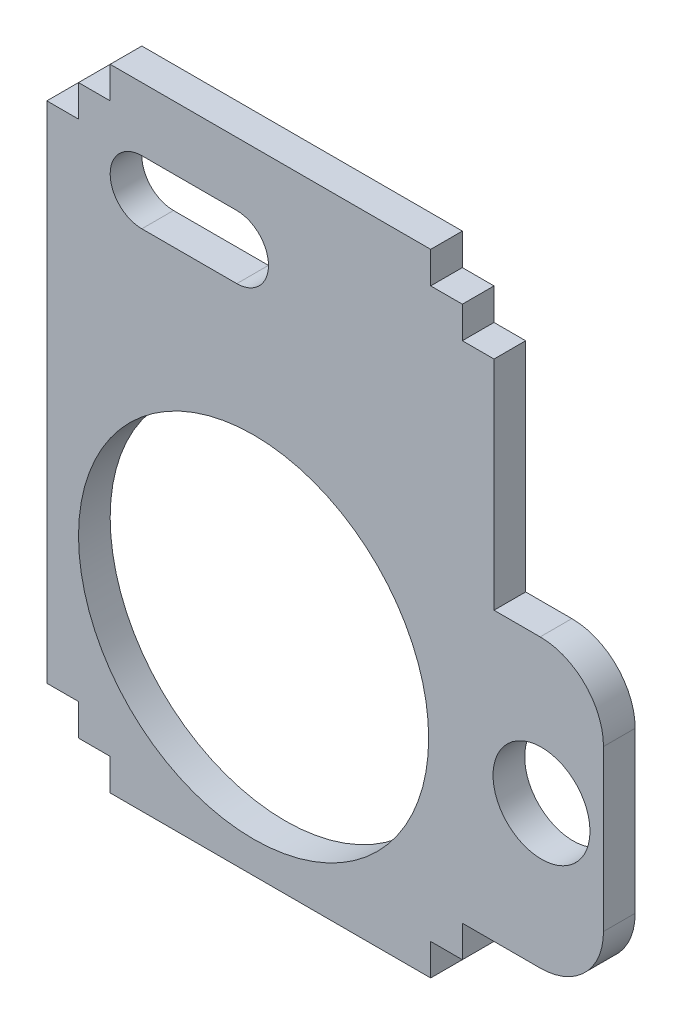
ISO-10303-21;
HEADER;
FILE_DESCRIPTION(('STEP AP214'),'2;1');
FILE_NAME('part.step','',(''),(''),'','','');
FILE_SCHEMA(('AUTOMOTIVE_DESIGN { 1 0 10303 214 1 1 1 1 }'));
ENDSEC;
DATA;
#1=APPLICATION_CONTEXT('core data for automotive mechanical design processes');
#2=APPLICATION_PROTOCOL_DEFINITION('international standard','automotive_design',2000,#1);
#3=PRODUCT_CONTEXT('',#1,'mechanical');
#4=PRODUCT('Part','Part','',(#3));
#5=PRODUCT_RELATED_PRODUCT_CATEGORY('part','',(#4));
#6=PRODUCT_DEFINITION_FORMATION('','',#4);
#7=PRODUCT_DEFINITION_CONTEXT('part definition',#1,'design');
#8=PRODUCT_DEFINITION('design','',#6,#7);
#9=PRODUCT_DEFINITION_SHAPE('','',#8);
#10=(LENGTH_UNIT() NAMED_UNIT(*) SI_UNIT(.MILLI.,.METRE.));
#11=(NAMED_UNIT(*) PLANE_ANGLE_UNIT() SI_UNIT($,.RADIAN.));
#12=(NAMED_UNIT(*) SI_UNIT($,.STERADIAN.) SOLID_ANGLE_UNIT());
#13=UNCERTAINTY_MEASURE_WITH_UNIT(LENGTH_MEASURE(1.E-05),#10,'distance_accuracy_value','');
#14=(GEOMETRIC_REPRESENTATION_CONTEXT(3) GLOBAL_UNCERTAINTY_ASSIGNED_CONTEXT((#13)) GLOBAL_UNIT_ASSIGNED_CONTEXT((#10,
#11,#12)) REPRESENTATION_CONTEXT('',''));
#15=CARTESIAN_POINT('',(0.,0.,0.));
#16=DIRECTION('',(0.,0.,1.));
#17=DIRECTION('',(1.,0.,0.));
#18=AXIS2_PLACEMENT_3D('',#15,#16,#17);
#19=CARTESIAN_POINT('',(-30.2332861119316,-35.1836502917995,-6.35));
#20=DIRECTION('',(0.,-1.,0.));
#21=DIRECTION('',(0.,0.,-1.));
#22=AXIS2_PLACEMENT_3D('',#19,#20,#21);
#23=PLANE('',#22);
#24=DIRECTION('',(1.,0.,0.));
#25=VECTOR('',#24,1.);
#26=CARTESIAN_POINT('',(-30.2332861119316,-35.1836502917995,0.));
#27=LINE('',#26,#25);
#28=CARTESIAN_POINT('',(-30.2332861119316,-35.1836502917995,0.));
#29=VERTEX_POINT('',#28);
#30=CARTESIAN_POINT('',(-23.8832861119316,-35.1836502917995,0.));
#31=VERTEX_POINT('',#30);
#32=EDGE_CURVE('E264',#29,#31,#27,.T.);
#33=ORIENTED_EDGE('',*,*,#32,.F.);
#34=DIRECTION('',(0.,0.,1.));
#35=VECTOR('',#34,1.);
#36=CARTESIAN_POINT('',(-30.2332861119316,-35.1836502917995,-6.35));
#37=LINE('',#36,#35);
#38=CARTESIAN_POINT('',(-30.2332861119316,-35.1836502917995,-6.35));
#39=VERTEX_POINT('',#38);
#40=EDGE_CURVE('E11',#39,#29,#37,.T.);
#41=ORIENTED_EDGE('',*,*,#40,.F.);
#42=DIRECTION('',(1.,0.,0.));
#43=VECTOR('',#42,1.);
#44=CARTESIAN_POINT('',(-30.2332861119316,-35.1836502917995,-6.35));
#45=LINE('',#44,#43);
#46=CARTESIAN_POINT('',(-23.8832861119316,-35.1836502917995,-6.35));
#47=VERTEX_POINT('',#46);
#48=EDGE_CURVE('E267',#39,#47,#45,.T.);
#49=ORIENTED_EDGE('',*,*,#48,.T.);
#50=DIRECTION('',(0.,0.,1.));
#51=VECTOR('',#50,1.);
#52=CARTESIAN_POINT('',(-23.8832861119316,-35.1836502917995,-6.35));
#53=LINE('',#52,#51);
#54=EDGE_CURVE('E36',#47,#31,#53,.T.);
#55=ORIENTED_EDGE('',*,*,#54,.T.);
#56=EDGE_LOOP('',(#33,#41,#49,#55));
#57=FACE_BOUND('',#56,.T.);
#58=ADVANCED_FACE('F33',(#57),#23,.T.);
#59=CARTESIAN_POINT('',(-30.2332861119316,-28.8336502917995,-6.35));
#60=DIRECTION('',(-1.,0.,0.));
#61=DIRECTION('',(0.,0.,1.));
#62=AXIS2_PLACEMENT_3D('',#59,#60,#61);
#63=PLANE('',#62);
#64=DIRECTION('',(0.,-1.,0.));
#65=VECTOR('',#64,1.);
#66=CARTESIAN_POINT('',(-30.2332861119316,-28.8336502917995,0.));
#67=LINE('',#66,#65);
#68=CARTESIAN_POINT('',(-30.2332861119316,-28.8336502917995,0.));
#69=VERTEX_POINT('',#68);
#70=EDGE_CURVE('E271',#69,#29,#67,.T.);
#71=ORIENTED_EDGE('',*,*,#70,.F.);
#72=DIRECTION('',(0.,0.,1.));
#73=VECTOR('',#72,1.);
#74=CARTESIAN_POINT('',(-30.2332861119316,-28.8336502917995,-6.35));
#75=LINE('',#74,#73);
#76=CARTESIAN_POINT('',(-30.2332861119316,-28.8336502917995,-6.35));
#77=VERTEX_POINT('',#76);
#78=EDGE_CURVE('E41',#77,#69,#75,.T.);
#79=ORIENTED_EDGE('',*,*,#78,.F.);
#80=DIRECTION('',(0.,-1.,0.));
#81=VECTOR('',#80,1.);
#82=CARTESIAN_POINT('',(-30.2332861119316,-28.8336502917995,-6.35));
#83=LINE('',#82,#81);
#84=EDGE_CURVE('E337',#77,#39,#83,.T.);
#85=ORIENTED_EDGE('',*,*,#84,.T.);
#86=ORIENTED_EDGE('',*,*,#40,.T.);
#87=EDGE_LOOP('',(#71,#79,#85,#86));
#88=FACE_BOUND('',#87,.T.);
#89=ADVANCED_FACE('F464',(#88),#63,.T.);
#90=CARTESIAN_POINT('',(-36.5832861119316,-28.8336502917995,-6.35));
#91=DIRECTION('',(0.,-1.,0.));
#92=DIRECTION('',(0.,0.,-1.));
#93=AXIS2_PLACEMENT_3D('',#90,#91,#92);
#94=PLANE('',#93);
#95=DIRECTION('',(1.,0.,0.));
#96=VECTOR('',#95,1.);
#97=CARTESIAN_POINT('',(-36.5832861119316,-28.8336502917995,0.));
#98=LINE('',#97,#96);
#99=CARTESIAN_POINT('',(-36.5832861119316,-28.8336502917995,0.));
#100=VERTEX_POINT('',#99);
#101=EDGE_CURVE('E405',#100,#69,#98,.T.);
#102=ORIENTED_EDGE('',*,*,#101,.F.);
#103=DIRECTION('',(0.,0.,1.));
#104=VECTOR('',#103,1.);
#105=CARTESIAN_POINT('',(-36.5832861119316,-28.8336502917995,-6.35));
#106=LINE('',#105,#104);
#107=CARTESIAN_POINT('',(-36.5832861119316,-28.8336502917995,-6.35));
#108=VERTEX_POINT('',#107);
#109=EDGE_CURVE('E411',#108,#100,#106,.T.);
#110=ORIENTED_EDGE('',*,*,#109,.F.);
#111=DIRECTION('',(1.,0.,0.));
#112=VECTOR('',#111,1.);
#113=CARTESIAN_POINT('',(-36.5832861119316,-28.8336502917995,-6.35));
#114=LINE('',#113,#112);
#115=EDGE_CURVE('E334',#108,#77,#114,.T.);
#116=ORIENTED_EDGE('',*,*,#115,.T.);
#117=ORIENTED_EDGE('',*,*,#78,.T.);
#118=EDGE_LOOP('',(#102,#110,#116,#117));
#119=FACE_BOUND('',#118,.T.);
#120=ADVANCED_FACE('F548',(#119),#94,.T.);
#121=CARTESIAN_POINT('',(-36.5832861119316,72.3345497082005,-6.35));
#122=DIRECTION('',(-1.,0.,0.));
#123=DIRECTION('',(0.,0.,1.));
#124=AXIS2_PLACEMENT_3D('',#121,#122,#123);
#125=PLANE('',#124);
#126=DIRECTION('',(0.,-1.,0.));
#127=VECTOR('',#126,1.);
#128=CARTESIAN_POINT('',(-36.5832861119316,72.3345497082005,0.));
#129=LINE('',#128,#127);
#130=CARTESIAN_POINT('',(-36.5832861119316,72.3345497082005,0.));
#131=VERTEX_POINT('',#130);
#132=EDGE_CURVE('E402',#131,#100,#129,.T.);
#133=ORIENTED_EDGE('',*,*,#132,.F.);
#134=DIRECTION('',(0.,0.,1.));
#135=VECTOR('',#134,1.);
#136=CARTESIAN_POINT('',(-36.5832861119316,72.3345497082005,-6.35));
#137=LINE('',#136,#135);
#138=CARTESIAN_POINT('',(-36.5832861119316,72.3345497082005,-6.35));
#139=VERTEX_POINT('',#138);
#140=EDGE_CURVE('E413',#139,#131,#137,.T.);
#141=ORIENTED_EDGE('',*,*,#140,.F.);
#142=DIRECTION('',(0.,-1.,0.));
#143=VECTOR('',#142,1.);
#144=CARTESIAN_POINT('',(-36.5832861119316,72.3345497082005,-6.35));
#145=LINE('',#144,#143);
#146=EDGE_CURVE('E331',#139,#108,#145,.T.);
#147=ORIENTED_EDGE('',*,*,#146,.T.);
#148=ORIENTED_EDGE('',*,*,#109,.T.);
#149=EDGE_LOOP('',(#133,#141,#147,#148));
#150=FACE_BOUND('',#149,.T.);
#151=ADVANCED_FACE('F545',(#150),#125,.T.);
#152=CARTESIAN_POINT('',(-30.2332861119316,72.3345497082005,-6.35));
#153=DIRECTION('',(0.,1.,0.));
#154=DIRECTION('',(0.,0.,1.));
#155=AXIS2_PLACEMENT_3D('',#152,#153,#154);
#156=PLANE('',#155);
#157=DIRECTION('',(-1.,0.,0.));
#158=VECTOR('',#157,1.);
#159=CARTESIAN_POINT('',(-30.2332861119316,72.3345497082005,0.));
#160=LINE('',#159,#158);
#161=CARTESIAN_POINT('',(-30.2332861119316,72.3345497082005,0.));
#162=VERTEX_POINT('',#161);
#163=EDGE_CURVE('E399',#162,#131,#160,.T.);
#164=ORIENTED_EDGE('',*,*,#163,.F.);
#165=DIRECTION('',(0.,0.,1.));
#166=VECTOR('',#165,1.);
#167=CARTESIAN_POINT('',(-30.2332861119316,72.3345497082005,-6.35));
#168=LINE('',#167,#166);
#169=CARTESIAN_POINT('',(-30.2332861119316,72.3345497082005,-6.35));
#170=VERTEX_POINT('',#169);
#171=EDGE_CURVE('E415',#170,#162,#168,.T.);
#172=ORIENTED_EDGE('',*,*,#171,.F.);
#173=DIRECTION('',(-1.,0.,0.));
#174=VECTOR('',#173,1.);
#175=CARTESIAN_POINT('',(-30.2332861119316,72.3345497082005,-6.35));
#176=LINE('',#175,#174);
#177=EDGE_CURVE('E328',#170,#139,#176,.T.);
#178=ORIENTED_EDGE('',*,*,#177,.T.);
#179=ORIENTED_EDGE('',*,*,#140,.T.);
#180=EDGE_LOOP('',(#164,#172,#178,#179));
#181=FACE_BOUND('',#180,.T.);
#182=ADVANCED_FACE('F542',(#181),#156,.T.);
#183=CARTESIAN_POINT('',(-30.2332861119316,78.6845497082005,-6.35));
#184=DIRECTION('',(-1.,0.,0.));
#185=DIRECTION('',(0.,0.,1.));
#186=AXIS2_PLACEMENT_3D('',#183,#184,#185);
#187=PLANE('',#186);
#188=DIRECTION('',(0.,-1.,0.));
#189=VECTOR('',#188,1.);
#190=CARTESIAN_POINT('',(-30.2332861119316,78.6845497082005,0.));
#191=LINE('',#190,#189);
#192=CARTESIAN_POINT('',(-30.2332861119316,78.6845497082005,0.));
#193=VERTEX_POINT('',#192);
#194=EDGE_CURVE('E396',#193,#162,#191,.T.);
#195=ORIENTED_EDGE('',*,*,#194,.F.);
#196=DIRECTION('',(0.,0.,1.));
#197=VECTOR('',#196,1.);
#198=CARTESIAN_POINT('',(-30.2332861119316,78.6845497082005,-6.35));
#199=LINE('',#198,#197);
#200=CARTESIAN_POINT('',(-30.2332861119316,78.6845497082005,-6.35));
#201=VERTEX_POINT('',#200);
#202=EDGE_CURVE('E417',#201,#193,#199,.T.);
#203=ORIENTED_EDGE('',*,*,#202,.F.);
#204=DIRECTION('',(0.,-1.,0.));
#205=VECTOR('',#204,1.);
#206=CARTESIAN_POINT('',(-30.2332861119316,78.6845497082005,-6.35));
#207=LINE('',#206,#205);
#208=EDGE_CURVE('E325',#201,#170,#207,.T.);
#209=ORIENTED_EDGE('',*,*,#208,.T.);
#210=ORIENTED_EDGE('',*,*,#171,.T.);
#211=EDGE_LOOP('',(#195,#203,#209,#210));
#212=FACE_BOUND('',#211,.T.);
#213=ADVANCED_FACE('F538',(#212),#187,.T.);
#214=CARTESIAN_POINT('',(-23.8832861119316,78.6845497082005,-6.35));
#215=DIRECTION('',(0.,1.,0.));
#216=DIRECTION('',(-1.,0.,0.));
#217=AXIS2_PLACEMENT_3D('',#214,#215,#216);
#218=PLANE('',#217);
#219=DIRECTION('',(-1.,0.,0.));
#220=VECTOR('',#219,1.);
#221=CARTESIAN_POINT('',(-23.8832861119316,78.6845497082005,0.));
#222=LINE('',#221,#220);
#223=CARTESIAN_POINT('',(-23.8832861119316,78.6845497082005,0.));
#224=VERTEX_POINT('',#223);
#225=EDGE_CURVE('E393',#224,#193,#222,.T.);
#226=ORIENTED_EDGE('',*,*,#225,.F.);
#227=DIRECTION('',(0.,0.,1.));
#228=VECTOR('',#227,1.);
#229=CARTESIAN_POINT('',(-23.8832861119316,78.6845497082005,-6.35));
#230=LINE('',#229,#228);
#231=CARTESIAN_POINT('',(-23.8832861119316,78.6845497082005,-6.35));
#232=VERTEX_POINT('',#231);
#233=EDGE_CURVE('E419',#232,#224,#230,.T.);
#234=ORIENTED_EDGE('',*,*,#233,.F.);
#235=DIRECTION('',(-1.,0.,0.));
#236=VECTOR('',#235,1.);
#237=CARTESIAN_POINT('',(-23.8832861119316,78.6845497082005,-6.35));
#238=LINE('',#237,#236);
#239=EDGE_CURVE('E322',#232,#201,#238,.T.);
#240=ORIENTED_EDGE('',*,*,#239,.T.);
#241=ORIENTED_EDGE('',*,*,#202,.T.);
#242=EDGE_LOOP('',(#226,#234,#240,#241));
#243=FACE_BOUND('',#242,.T.);
#244=ADVANCED_FACE('F534',(#243),#218,.T.);
#245=CARTESIAN_POINT('',(-23.8832861119316,85.0345497082005,-6.35));
#246=DIRECTION('',(-1.,0.,0.));
#247=DIRECTION('',(0.,-1.,0.));
#248=AXIS2_PLACEMENT_3D('',#245,#246,#247);
#249=PLANE('',#248);
#250=DIRECTION('',(0.,-1.,0.));
#251=VECTOR('',#250,1.);
#252=CARTESIAN_POINT('',(-23.8832861119316,85.0345497082005,0.));
#253=LINE('',#252,#251);
#254=CARTESIAN_POINT('',(-23.8832861119316,85.0345497082005,0.));
#255=VERTEX_POINT('',#254);
#256=EDGE_CURVE('E390',#255,#224,#253,.T.);
#257=ORIENTED_EDGE('',*,*,#256,.F.);
#258=DIRECTION('',(0.,0.,1.));
#259=VECTOR('',#258,1.);
#260=CARTESIAN_POINT('',(-23.8832861119316,85.0345497082005,-6.35));
#261=LINE('',#260,#259);
#262=CARTESIAN_POINT('',(-23.8832861119316,85.0345497082005,-6.35));
#263=VERTEX_POINT('',#262);
#264=EDGE_CURVE('E421',#263,#255,#261,.T.);
#265=ORIENTED_EDGE('',*,*,#264,.F.);
#266=DIRECTION('',(0.,-1.,0.));
#267=VECTOR('',#266,1.);
#268=CARTESIAN_POINT('',(-23.8832861119316,85.0345497082005,-6.35));
#269=LINE('',#268,#267);
#270=EDGE_CURVE('E319',#263,#232,#269,.T.);
#271=ORIENTED_EDGE('',*,*,#270,.T.);
#272=ORIENTED_EDGE('',*,*,#233,.T.);
#273=EDGE_LOOP('',(#257,#265,#271,#272));
#274=FACE_BOUND('',#273,.T.);
#275=ADVANCED_FACE('F530',(#274),#249,.T.);
#276=CARTESIAN_POINT('',(40.4041138880684,85.0345497082005,-6.35));
#277=DIRECTION('',(0.,1.,0.));
#278=DIRECTION('',(-1.,0.,0.));
#279=AXIS2_PLACEMENT_3D('',#276,#277,#278);
#280=PLANE('',#279);
#281=DIRECTION('',(-1.,0.,0.));
#282=VECTOR('',#281,1.);
#283=CARTESIAN_POINT('',(40.4041138880684,85.0345497082005,0.));
#284=LINE('',#283,#282);
#285=CARTESIAN_POINT('',(40.4041138880684,85.0345497082005,0.));
#286=VERTEX_POINT('',#285);
#287=EDGE_CURVE('E387',#286,#255,#284,.T.);
#288=ORIENTED_EDGE('',*,*,#287,.F.);
#289=DIRECTION('',(0.,0.,1.));
#290=VECTOR('',#289,1.);
#291=CARTESIAN_POINT('',(40.4041138880684,85.0345497082005,-6.35));
#292=LINE('',#291,#290);
#293=CARTESIAN_POINT('',(40.4041138880684,85.0345497082005,-6.35));
#294=VERTEX_POINT('',#293);
#295=EDGE_CURVE('E423',#294,#286,#292,.T.);
#296=ORIENTED_EDGE('',*,*,#295,.F.);
#297=DIRECTION('',(-1.,0.,0.));
#298=VECTOR('',#297,1.);
#299=CARTESIAN_POINT('',(40.4041138880684,85.0345497082005,-6.35));
#300=LINE('',#299,#298);
#301=EDGE_CURVE('E316',#294,#263,#300,.T.);
#302=ORIENTED_EDGE('',*,*,#301,.T.);
#303=ORIENTED_EDGE('',*,*,#264,.T.);
#304=EDGE_LOOP('',(#288,#296,#302,#303));
#305=FACE_BOUND('',#304,.T.);
#306=ADVANCED_FACE('F526',(#305),#280,.T.);
#307=CARTESIAN_POINT('',(40.4041138880684,78.6845497082005,-6.35));
#308=DIRECTION('',(1.,0.,0.));
#309=DIRECTION('',(0.,0.,-1.));
#310=AXIS2_PLACEMENT_3D('',#307,#308,#309);
#311=PLANE('',#310);
#312=DIRECTION('',(0.,1.,0.));
#313=VECTOR('',#312,1.);
#314=CARTESIAN_POINT('',(40.4041138880684,78.6845497082005,0.));
#315=LINE('',#314,#313);
#316=CARTESIAN_POINT('',(40.4041138880684,78.6845497082005,0.));
#317=VERTEX_POINT('',#316);
#318=EDGE_CURVE('E384',#317,#286,#315,.T.);
#319=ORIENTED_EDGE('',*,*,#318,.F.);
#320=DIRECTION('',(0.,0.,1.));
#321=VECTOR('',#320,1.);
#322=CARTESIAN_POINT('',(40.4041138880684,78.6845497082005,-6.35));
#323=LINE('',#322,#321);
#324=CARTESIAN_POINT('',(40.4041138880684,78.6845497082005,-6.35));
#325=VERTEX_POINT('',#324);
#326=EDGE_CURVE('E425',#325,#317,#323,.T.);
#327=ORIENTED_EDGE('',*,*,#326,.F.);
#328=DIRECTION('',(0.,1.,0.));
#329=VECTOR('',#328,1.);
#330=CARTESIAN_POINT('',(40.4041138880684,78.6845497082005,-6.35));
#331=LINE('',#330,#329);
#332=EDGE_CURVE('E313',#325,#294,#331,.T.);
#333=ORIENTED_EDGE('',*,*,#332,.T.);
#334=ORIENTED_EDGE('',*,*,#295,.T.);
#335=EDGE_LOOP('',(#319,#327,#333,#334));
#336=FACE_BOUND('',#335,.T.);
#337=ADVANCED_FACE('F522',(#336),#311,.T.);
#338=CARTESIAN_POINT('',(46.7541138880684,78.6845497082005,-6.35));
#339=DIRECTION('',(0.,1.,0.));
#340=DIRECTION('',(0.,0.,1.));
#341=AXIS2_PLACEMENT_3D('',#338,#339,#340);
#342=PLANE('',#341);
#343=DIRECTION('',(-1.,0.,0.));
#344=VECTOR('',#343,1.);
#345=CARTESIAN_POINT('',(46.7541138880684,78.6845497082005,0.));
#346=LINE('',#345,#344);
#347=CARTESIAN_POINT('',(46.7541138880684,78.6845497082005,0.));
#348=VERTEX_POINT('',#347);
#349=EDGE_CURVE('E381',#348,#317,#346,.T.);
#350=ORIENTED_EDGE('',*,*,#349,.F.);
#351=DIRECTION('',(0.,0.,1.));
#352=VECTOR('',#351,1.);
#353=CARTESIAN_POINT('',(46.7541138880684,78.6845497082005,-6.35));
#354=LINE('',#353,#352);
#355=CARTESIAN_POINT('',(46.7541138880684,78.6845497082005,-6.35));
#356=VERTEX_POINT('',#355);
#357=EDGE_CURVE('E427',#356,#348,#354,.T.);
#358=ORIENTED_EDGE('',*,*,#357,.F.);
#359=DIRECTION('',(-1.,0.,0.));
#360=VECTOR('',#359,1.);
#361=CARTESIAN_POINT('',(46.7541138880684,78.6845497082005,-6.35));
#362=LINE('',#361,#360);
#363=EDGE_CURVE('E310',#356,#325,#362,.T.);
#364=ORIENTED_EDGE('',*,*,#363,.T.);
#365=ORIENTED_EDGE('',*,*,#326,.T.);
#366=EDGE_LOOP('',(#350,#358,#364,#365));
#367=FACE_BOUND('',#366,.T.);
#368=ADVANCED_FACE('F518',(#367),#342,.T.);
#369=CARTESIAN_POINT('',(46.7541138880684,72.3345497082005,-6.35));
#370=DIRECTION('',(1.,0.,0.));
#371=DIRECTION('',(0.,0.,-1.));
#372=AXIS2_PLACEMENT_3D('',#369,#370,#371);
#373=PLANE('',#372);
#374=DIRECTION('',(0.,1.,0.));
#375=VECTOR('',#374,1.);
#376=CARTESIAN_POINT('',(46.7541138880684,72.3345497082005,0.));
#377=LINE('',#376,#375);
#378=CARTESIAN_POINT('',(46.7541138880684,72.3345497082005,0.));
#379=VERTEX_POINT('',#378);
#380=EDGE_CURVE('E378',#379,#348,#377,.T.);
#381=ORIENTED_EDGE('',*,*,#380,.F.);
#382=DIRECTION('',(0.,0.,1.));
#383=VECTOR('',#382,1.);
#384=CARTESIAN_POINT('',(46.7541138880684,72.3345497082005,-6.35));
#385=LINE('',#384,#383);
#386=CARTESIAN_POINT('',(46.7541138880684,72.3345497082005,-6.35));
#387=VERTEX_POINT('',#386);
#388=EDGE_CURVE('E429',#387,#379,#385,.T.);
#389=ORIENTED_EDGE('',*,*,#388,.F.);
#390=DIRECTION('',(0.,1.,0.));
#391=VECTOR('',#390,1.);
#392=CARTESIAN_POINT('',(46.7541138880684,72.3345497082005,-6.35));
#393=LINE('',#392,#391);
#394=EDGE_CURVE('E307',#387,#356,#393,.T.);
#395=ORIENTED_EDGE('',*,*,#394,.T.);
#396=ORIENTED_EDGE('',*,*,#357,.T.);
#397=EDGE_LOOP('',(#381,#389,#395,#396));
#398=FACE_BOUND('',#397,.T.);
#399=ADVANCED_FACE('F514',(#398),#373,.T.);
#400=CARTESIAN_POINT('',(53.1041138880684,72.3345497082005,-6.35));
#401=DIRECTION('',(0.,1.,0.));
#402=DIRECTION('',(-1.,0.,0.));
#403=AXIS2_PLACEMENT_3D('',#400,#401,#402);
#404=PLANE('',#403);
#405=DIRECTION('',(-1.,0.,0.));
#406=VECTOR('',#405,1.);
#407=CARTESIAN_POINT('',(53.1041138880684,72.3345497082005,0.));
#408=LINE('',#407,#406);
#409=CARTESIAN_POINT('',(53.1041138880684,72.3345497082005,0.));
#410=VERTEX_POINT('',#409);
#411=EDGE_CURVE('E375',#410,#379,#408,.T.);
#412=ORIENTED_EDGE('',*,*,#411,.F.);
#413=DIRECTION('',(0.,0.,1.));
#414=VECTOR('',#413,1.);
#415=CARTESIAN_POINT('',(53.1041138880684,72.3345497082005,-6.35));
#416=LINE('',#415,#414);
#417=CARTESIAN_POINT('',(53.1041138880684,72.3345497082005,-6.35));
#418=VERTEX_POINT('',#417);
#419=EDGE_CURVE('E431',#418,#410,#416,.T.);
#420=ORIENTED_EDGE('',*,*,#419,.F.);
#421=DIRECTION('',(-1.,0.,0.));
#422=VECTOR('',#421,1.);
#423=CARTESIAN_POINT('',(53.1041138880684,72.3345497082005,-6.35));
#424=LINE('',#423,#422);
#425=EDGE_CURVE('E304',#418,#387,#424,.T.);
#426=ORIENTED_EDGE('',*,*,#425,.T.);
#427=ORIENTED_EDGE('',*,*,#388,.T.);
#428=EDGE_LOOP('',(#412,#420,#426,#427));
#429=FACE_BOUND('',#428,.T.);
#430=ADVANCED_FACE('F510',(#429),#404,.T.);
#431=CARTESIAN_POINT('',(53.1041138880684,28.6973497082005,-6.35));
#432=DIRECTION('',(1.,0.,0.));
#433=DIRECTION('',(0.,1.,0.));
#434=AXIS2_PLACEMENT_3D('',#431,#432,#433);
#435=PLANE('',#434);
#436=DIRECTION('',(0.,1.,0.));
#437=VECTOR('',#436,1.);
#438=CARTESIAN_POINT('',(53.1041138880684,28.6973497082005,0.));
#439=LINE('',#438,#437);
#440=CARTESIAN_POINT('',(53.1041138880684,28.6973497082005,0.));
#441=VERTEX_POINT('',#440);
#442=EDGE_CURVE('E372',#441,#410,#439,.T.);
#443=ORIENTED_EDGE('',*,*,#442,.F.);
#444=DIRECTION('',(0.,0.,1.));
#445=VECTOR('',#444,1.);
#446=CARTESIAN_POINT('',(53.1041138880684,28.6973497082005,-6.35));
#447=LINE('',#446,#445);
#448=CARTESIAN_POINT('',(53.1041138880684,28.6973497082005,-6.35));
#449=VERTEX_POINT('',#448);
#450=EDGE_CURVE('E433',#449,#441,#447,.T.);
#451=ORIENTED_EDGE('',*,*,#450,.F.);
#452=DIRECTION('',(0.,1.,0.));
#453=VECTOR('',#452,1.);
#454=CARTESIAN_POINT('',(53.1041138880684,28.6973497082005,-6.35));
#455=LINE('',#454,#453);
#456=EDGE_CURVE('E301',#449,#418,#455,.T.);
#457=ORIENTED_EDGE('',*,*,#456,.T.);
#458=ORIENTED_EDGE('',*,*,#419,.T.);
#459=EDGE_LOOP('',(#443,#451,#457,#458));
#460=FACE_BOUND('',#459,.T.);
#461=ADVANCED_FACE('F506',(#460),#435,.T.);
#462=CARTESIAN_POINT('',(62.3624138880682,28.6973497082006,-6.35));
#463=DIRECTION('',(0.,1.,0.));
#464=DIRECTION('',(-1.,0.,0.));
#465=AXIS2_PLACEMENT_3D('',#462,#463,#464);
#466=PLANE('',#465);
#467=DIRECTION('',(-1.,0.,0.));
#468=VECTOR('',#467,1.);
#469=CARTESIAN_POINT('',(62.3624138880682,28.6973497082006,0.));
#470=LINE('',#469,#468);
#471=CARTESIAN_POINT('',(62.3624138880682,28.6973497082006,0.));
#472=VERTEX_POINT('',#471);
#473=EDGE_CURVE('E369',#472,#441,#470,.T.);
#474=ORIENTED_EDGE('',*,*,#473,.F.);
#475=DIRECTION('',(0.,0.,1.));
#476=VECTOR('',#475,1.);
#477=CARTESIAN_POINT('',(62.3624138880682,28.6973497082006,-6.35));
#478=LINE('',#477,#476);
#479=CARTESIAN_POINT('',(62.3624138880682,28.6973497082006,-6.35));
#480=VERTEX_POINT('',#479);
#481=EDGE_CURVE('E435',#480,#472,#478,.T.);
#482=ORIENTED_EDGE('',*,*,#481,.F.);
#483=DIRECTION('',(-1.,0.,0.));
#484=VECTOR('',#483,1.);
#485=CARTESIAN_POINT('',(62.3624138880682,28.6973497082006,-6.35));
#486=LINE('',#485,#484);
#487=EDGE_CURVE('E298',#480,#449,#486,.T.);
#488=ORIENTED_EDGE('',*,*,#487,.T.);
#489=ORIENTED_EDGE('',*,*,#450,.T.);
#490=EDGE_LOOP('',(#474,#482,#488,#489));
#491=FACE_BOUND('',#490,.T.);
#492=ADVANCED_FACE('F502',(#491),#466,.T.);
#493=CARTESIAN_POINT('',(62.3624138880684,15.9973497082006,-6.35));
#494=DIRECTION('',(0.,0.,1.));
#495=DIRECTION('',(1.,0.,0.));
#496=AXIS2_PLACEMENT_3D('',#493,#494,#495);
#497=CYLINDRICAL_SURFACE('',#496,12.7);
#498=CARTESIAN_POINT('',(62.3624138880684,15.9973497082006,0.));
#499=DIRECTION('',(0.,0.,1.));
#500=DIRECTION('',(1.,0.,0.));
#501=AXIS2_PLACEMENT_3D('',#498,#499,#500);
#502=CIRCLE('',#501,12.7);
#503=CARTESIAN_POINT('',(75.0624138880684,15.9973497082005,0.));
#504=VERTEX_POINT('',#503);
#505=EDGE_CURVE('E366',#504,#472,#502,.T.);
#506=ORIENTED_EDGE('',*,*,#505,.F.);
#507=DIRECTION('',(0.,0.,1.));
#508=VECTOR('',#507,1.);
#509=CARTESIAN_POINT('',(75.0624138880684,15.9973497082005,-6.35));
#510=LINE('',#509,#508);
#511=CARTESIAN_POINT('',(75.0624138880684,15.9973497082005,-6.35));
#512=VERTEX_POINT('',#511);
#513=EDGE_CURVE('E437',#512,#504,#510,.T.);
#514=ORIENTED_EDGE('',*,*,#513,.F.);
#515=CARTESIAN_POINT('',(62.3624138880684,15.9973497082006,-6.35));
#516=DIRECTION('',(0.,0.,1.));
#517=DIRECTION('',(1.,0.,0.));
#518=AXIS2_PLACEMENT_3D('',#515,#516,#517);
#519=CIRCLE('',#518,12.7);
#520=EDGE_CURVE('E295',#512,#480,#519,.T.);
#521=ORIENTED_EDGE('',*,*,#520,.T.);
#522=ORIENTED_EDGE('',*,*,#481,.T.);
#523=EDGE_LOOP('',(#506,#514,#521,#522));
#524=FACE_BOUND('',#523,.T.);
#525=ADVANCED_FACE('F498',(#524),#497,.T.);
#526=CARTESIAN_POINT('',(75.0624138880684,-16.1336502917993,-6.35));
#527=DIRECTION('',(1.,0.,0.));
#528=DIRECTION('',(0.,0.,-1.));
#529=AXIS2_PLACEMENT_3D('',#526,#527,#528);
#530=PLANE('',#529);
#531=DIRECTION('',(0.,1.,0.));
#532=VECTOR('',#531,1.);
#533=CARTESIAN_POINT('',(75.0624138880684,-16.1336502917993,0.));
#534=LINE('',#533,#532);
#535=CARTESIAN_POINT('',(75.0624138880684,-16.1336502917993,0.));
#536=VERTEX_POINT('',#535);
#537=EDGE_CURVE('E363',#536,#504,#534,.T.);
#538=ORIENTED_EDGE('',*,*,#537,.F.);
#539=DIRECTION('',(0.,0.,1.));
#540=VECTOR('',#539,1.);
#541=CARTESIAN_POINT('',(75.0624138880684,-16.1336502917993,-6.35));
#542=LINE('',#541,#540);
#543=CARTESIAN_POINT('',(75.0624138880684,-16.1336502917993,-6.35));
#544=VERTEX_POINT('',#543);
#545=EDGE_CURVE('E439',#544,#536,#542,.T.);
#546=ORIENTED_EDGE('',*,*,#545,.F.);
#547=DIRECTION('',(0.,1.,0.));
#548=VECTOR('',#547,1.);
#549=CARTESIAN_POINT('',(75.0624138880684,-16.1336502917993,-6.35));
#550=LINE('',#549,#548);
#551=EDGE_CURVE('E292',#544,#512,#550,.T.);
#552=ORIENTED_EDGE('',*,*,#551,.T.);
#553=ORIENTED_EDGE('',*,*,#513,.T.);
#554=EDGE_LOOP('',(#538,#546,#552,#553));
#555=FACE_BOUND('',#554,.T.);
#556=ADVANCED_FACE('F494',(#555),#530,.T.);
#557=CARTESIAN_POINT('',(62.3624138880684,-16.1336502917994,-6.35));
#558=DIRECTION('',(0.,0.,1.));
#559=DIRECTION('',(1.,0.,0.));
#560=AXIS2_PLACEMENT_3D('',#557,#558,#559);
#561=CYLINDRICAL_SURFACE('',#560,12.7);
#562=CARTESIAN_POINT('',(62.3624138880684,-16.1336502917994,0.));
#563=DIRECTION('',(0.,0.,1.));
#564=DIRECTION('',(-1.,0.,0.));
#565=AXIS2_PLACEMENT_3D('',#562,#563,#564);
#566=CIRCLE('',#565,12.7);
#567=CARTESIAN_POINT('',(62.3624138880684,-28.8336502917994,0.));
#568=VERTEX_POINT('',#567);
#569=EDGE_CURVE('E360',#568,#536,#566,.T.);
#570=ORIENTED_EDGE('',*,*,#569,.F.);
#571=DIRECTION('',(0.,0.,1.));
#572=VECTOR('',#571,1.);
#573=CARTESIAN_POINT('',(62.3624138880684,-28.8336502917994,-6.35));
#574=LINE('',#573,#572);
#575=CARTESIAN_POINT('',(62.3624138880684,-28.8336502917994,-6.35));
#576=VERTEX_POINT('',#575);
#577=EDGE_CURVE('E441',#576,#568,#574,.T.);
#578=ORIENTED_EDGE('',*,*,#577,.F.);
#579=CARTESIAN_POINT('',(62.3624138880684,-16.1336502917994,-6.35));
#580=DIRECTION('',(0.,0.,1.));
#581=DIRECTION('',(-1.,0.,0.));
#582=AXIS2_PLACEMENT_3D('',#579,#580,#581);
#583=CIRCLE('',#582,12.7);
#584=EDGE_CURVE('E289',#576,#544,#583,.T.);
#585=ORIENTED_EDGE('',*,*,#584,.T.);
#586=ORIENTED_EDGE('',*,*,#545,.T.);
#587=EDGE_LOOP('',(#570,#578,#585,#586));
#588=FACE_BOUND('',#587,.T.);
#589=ADVANCED_FACE('F490',(#588),#561,.T.);
#590=CARTESIAN_POINT('',(46.7541138880684,-28.8336502917995,-6.35));
#591=DIRECTION('',(0.,-1.,0.));
#592=DIRECTION('',(1.,0.,0.));
#593=AXIS2_PLACEMENT_3D('',#590,#591,#592);
#594=PLANE('',#593);
#595=DIRECTION('',(1.,0.,0.));
#596=VECTOR('',#595,1.);
#597=CARTESIAN_POINT('',(46.7541138880684,-28.8336502917995,0.));
#598=LINE('',#597,#596);
#599=CARTESIAN_POINT('',(46.7541138880684,-28.8336502917995,0.));
#600=VERTEX_POINT('',#599);
#601=EDGE_CURVE('E357',#600,#568,#598,.T.);
#602=ORIENTED_EDGE('',*,*,#601,.F.);
#603=DIRECTION('',(0.,0.,1.));
#604=VECTOR('',#603,1.);
#605=CARTESIAN_POINT('',(46.7541138880684,-28.8336502917995,-6.35));
#606=LINE('',#605,#604);
#607=CARTESIAN_POINT('',(46.7541138880684,-28.8336502917995,-6.35));
#608=VERTEX_POINT('',#607);
#609=EDGE_CURVE('E443',#608,#600,#606,.T.);
#610=ORIENTED_EDGE('',*,*,#609,.F.);
#611=DIRECTION('',(1.,0.,0.));
#612=VECTOR('',#611,1.);
#613=CARTESIAN_POINT('',(46.7541138880684,-28.8336502917995,-6.35));
#614=LINE('',#613,#612);
#615=EDGE_CURVE('E286',#608,#576,#614,.T.);
#616=ORIENTED_EDGE('',*,*,#615,.T.);
#617=ORIENTED_EDGE('',*,*,#577,.T.);
#618=EDGE_LOOP('',(#602,#610,#616,#617));
#619=FACE_BOUND('',#618,.T.);
#620=ADVANCED_FACE('F486',(#619),#594,.T.);
#621=CARTESIAN_POINT('',(46.7541138880684,-35.1836502917995,-6.35));
#622=DIRECTION('',(1.,0.,0.));
#623=DIRECTION('',(0.,0.,-1.));
#624=AXIS2_PLACEMENT_3D('',#621,#622,#623);
#625=PLANE('',#624);
#626=DIRECTION('',(0.,1.,0.));
#627=VECTOR('',#626,1.);
#628=CARTESIAN_POINT('',(46.7541138880684,-35.1836502917995,0.));
#629=LINE('',#628,#627);
#630=CARTESIAN_POINT('',(46.7541138880684,-35.1836502917995,0.));
#631=VERTEX_POINT('',#630);
#632=EDGE_CURVE('E354',#631,#600,#629,.T.);
#633=ORIENTED_EDGE('',*,*,#632,.F.);
#634=DIRECTION('',(0.,0.,1.));
#635=VECTOR('',#634,1.);
#636=CARTESIAN_POINT('',(46.7541138880684,-35.1836502917995,-6.35));
#637=LINE('',#636,#635);
#638=CARTESIAN_POINT('',(46.7541138880684,-35.1836502917995,-6.35));
#639=VERTEX_POINT('',#638);
#640=EDGE_CURVE('E445',#639,#631,#637,.T.);
#641=ORIENTED_EDGE('',*,*,#640,.F.);
#642=DIRECTION('',(0.,1.,0.));
#643=VECTOR('',#642,1.);
#644=CARTESIAN_POINT('',(46.7541138880684,-35.1836502917995,-6.35));
#645=LINE('',#644,#643);
#646=EDGE_CURVE('E283',#639,#608,#645,.T.);
#647=ORIENTED_EDGE('',*,*,#646,.T.);
#648=ORIENTED_EDGE('',*,*,#609,.T.);
#649=EDGE_LOOP('',(#633,#641,#647,#648));
#650=FACE_BOUND('',#649,.T.);
#651=ADVANCED_FACE('F482',(#650),#625,.T.);
#652=CARTESIAN_POINT('',(40.4041138880684,-35.1836502917995,-6.35));
#653=DIRECTION('',(0.,-1.,0.));
#654=DIRECTION('',(0.,0.,-1.));
#655=AXIS2_PLACEMENT_3D('',#652,#653,#654);
#656=PLANE('',#655);
#657=DIRECTION('',(1.,0.,0.));
#658=VECTOR('',#657,1.);
#659=CARTESIAN_POINT('',(40.4041138880684,-35.1836502917995,0.));
#660=LINE('',#659,#658);
#661=CARTESIAN_POINT('',(40.4041138880684,-35.1836502917995,0.));
#662=VERTEX_POINT('',#661);
#663=EDGE_CURVE('E351',#662,#631,#660,.T.);
#664=ORIENTED_EDGE('',*,*,#663,.F.);
#665=DIRECTION('',(0.,0.,1.));
#666=VECTOR('',#665,1.);
#667=CARTESIAN_POINT('',(40.4041138880684,-35.1836502917995,-6.35));
#668=LINE('',#667,#666);
#669=CARTESIAN_POINT('',(40.4041138880684,-35.1836502917995,-6.35));
#670=VERTEX_POINT('',#669);
#671=EDGE_CURVE('E447',#670,#662,#668,.T.);
#672=ORIENTED_EDGE('',*,*,#671,.F.);
#673=DIRECTION('',(1.,0.,0.));
#674=VECTOR('',#673,1.);
#675=CARTESIAN_POINT('',(40.4041138880684,-35.1836502917995,-6.35));
#676=LINE('',#675,#674);
#677=EDGE_CURVE('E280',#670,#639,#676,.T.);
#678=ORIENTED_EDGE('',*,*,#677,.T.);
#679=ORIENTED_EDGE('',*,*,#640,.T.);
#680=EDGE_LOOP('',(#664,#672,#678,#679));
#681=FACE_BOUND('',#680,.T.);
#682=ADVANCED_FACE('F478',(#681),#656,.T.);
#683=CARTESIAN_POINT('',(40.4041138880684,-41.5336502917995,-6.35));
#684=DIRECTION('',(1.,0.,0.));
#685=DIRECTION('',(0.,0.,-1.));
#686=AXIS2_PLACEMENT_3D('',#683,#684,#685);
#687=PLANE('',#686);
#688=DIRECTION('',(0.,1.,0.));
#689=VECTOR('',#688,1.);
#690=CARTESIAN_POINT('',(40.4041138880684,-41.5336502917995,0.));
#691=LINE('',#690,#689);
#692=CARTESIAN_POINT('',(40.4041138880684,-41.5336502917995,0.));
#693=VERTEX_POINT('',#692);
#694=EDGE_CURVE('E348',#693,#662,#691,.T.);
#695=ORIENTED_EDGE('',*,*,#694,.F.);
#696=DIRECTION('',(0.,0.,1.));
#697=VECTOR('',#696,1.);
#698=CARTESIAN_POINT('',(40.4041138880684,-41.5336502917995,-6.35));
#699=LINE('',#698,#697);
#700=CARTESIAN_POINT('',(40.4041138880684,-41.5336502917995,-6.35));
#701=VERTEX_POINT('',#700);
#702=EDGE_CURVE('E449',#701,#693,#699,.T.);
#703=ORIENTED_EDGE('',*,*,#702,.F.);
#704=DIRECTION('',(0.,1.,0.));
#705=VECTOR('',#704,1.);
#706=CARTESIAN_POINT('',(40.4041138880684,-41.5336502917995,-6.35));
#707=LINE('',#706,#705);
#708=EDGE_CURVE('E277',#701,#670,#707,.T.);
#709=ORIENTED_EDGE('',*,*,#708,.T.);
#710=ORIENTED_EDGE('',*,*,#671,.T.);
#711=EDGE_LOOP('',(#695,#703,#709,#710));
#712=FACE_BOUND('',#711,.T.);
#713=ADVANCED_FACE('F476',(#712),#687,.T.);
#714=CARTESIAN_POINT('',(-23.8832861119316,-41.5336502917995,-6.35));
#715=DIRECTION('',(0.,-1.,0.));
#716=DIRECTION('',(1.,0.,0.));
#717=AXIS2_PLACEMENT_3D('',#714,#715,#716);
#718=PLANE('',#717);
#719=DIRECTION('',(1.,0.,0.));
#720=VECTOR('',#719,1.);
#721=CARTESIAN_POINT('',(-23.8832861119316,-41.5336502917995,0.));
#722=LINE('',#721,#720);
#723=CARTESIAN_POINT('',(-23.8832861119316,-41.5336502917995,0.));
#724=VERTEX_POINT('',#723);
#725=EDGE_CURVE('E345',#724,#693,#722,.T.);
#726=ORIENTED_EDGE('',*,*,#725,.F.);
#727=DIRECTION('',(0.,0.,1.));
#728=VECTOR('',#727,1.);
#729=CARTESIAN_POINT('',(-23.8832861119316,-41.5336502917995,-6.35));
#730=LINE('',#729,#728);
#731=CARTESIAN_POINT('',(-23.8832861119316,-41.5336502917995,-6.35));
#732=VERTEX_POINT('',#731);
#733=EDGE_CURVE('E450',#732,#724,#730,.T.);
#734=ORIENTED_EDGE('',*,*,#733,.F.);
#735=DIRECTION('',(1.,0.,0.));
#736=VECTOR('',#735,1.);
#737=CARTESIAN_POINT('',(-23.8832861119316,-41.5336502917995,-6.35));
#738=LINE('',#737,#736);
#739=EDGE_CURVE('E274',#732,#701,#738,.T.);
#740=ORIENTED_EDGE('',*,*,#739,.T.);
#741=ORIENTED_EDGE('',*,*,#702,.T.);
#742=EDGE_LOOP('',(#726,#734,#740,#741));
#743=FACE_BOUND('',#742,.T.);
#744=ADVANCED_FACE('F472',(#743),#718,.T.);
#745=CARTESIAN_POINT('',(-23.8832861119316,-35.1836502917995,-6.35));
#746=DIRECTION('',(-1.,0.,0.));
#747=DIRECTION('',(0.,-1.,0.));
#748=AXIS2_PLACEMENT_3D('',#745,#746,#747);
#749=PLANE('',#748);
#750=DIRECTION('',(0.,-1.,0.));
#751=VECTOR('',#750,1.);
#752=CARTESIAN_POINT('',(-23.8832861119316,-35.1836502917995,0.));
#753=LINE('',#752,#751);
#754=EDGE_CURVE('E342',#31,#724,#753,.T.);
#755=ORIENTED_EDGE('',*,*,#754,.F.);
#756=ORIENTED_EDGE('',*,*,#54,.F.);
#757=DIRECTION('',(0.,-1.,0.));
#758=VECTOR('',#757,1.);
#759=CARTESIAN_POINT('',(-23.8832861119316,-35.1836502917995,-6.35));
#760=LINE('',#759,#758);
#761=EDGE_CURVE('E270',#47,#732,#760,.T.);
#762=ORIENTED_EDGE('',*,*,#761,.T.);
#763=ORIENTED_EDGE('',*,*,#733,.T.);
#764=EDGE_LOOP('',(#755,#756,#762,#763));
#765=FACE_BOUND('',#764,.T.);
#766=ADVANCED_FACE('F458',(#765),#749,.T.);
#767=CARTESIAN_POINT('',(62.3624138880684,-16.1336502917994,-6.35));
#768=DIRECTION('',(0.,0.,-1.));
#769=DIRECTION('',(-1.,0.,0.));
#770=AXIS2_PLACEMENT_3D('',#767,#768,#769);
#771=PLANE('',#770);
#772=CARTESIAN_POINT('',(-17.5332861119316,65.9845497082002,-6.35));
#773=DIRECTION('',(0.,0.,1.));
#774=DIRECTION('',(1.,0.,0.));
#775=AXIS2_PLACEMENT_3D('',#772,#773,#774);
#776=CIRCLE('',#775,6.35);
#777=CARTESIAN_POINT('',(-17.5332861119316,72.3345497082002,-6.35));
#778=VERTEX_POINT('',#777);
#779=CARTESIAN_POINT('',(-17.5332861119316,59.6345497082002,-6.35));
#780=VERTEX_POINT('',#779);
#781=EDGE_CURVE('E220',#778,#780,#776,.T.);
#782=ORIENTED_EDGE('',*,*,#781,.T.);
#783=DIRECTION('',(1.,0.,0.));
#784=VECTOR('',#783,1.);
#785=CARTESIAN_POINT('',(-17.5332861119316,59.6345497082002,-6.35));
#786=LINE('',#785,#784);
#787=CARTESIAN_POINT('',(1.5167138880684,59.6345497082002,-6.35));
#788=VERTEX_POINT('',#787);
#789=EDGE_CURVE('E229',#780,#788,#786,.T.);
#790=ORIENTED_EDGE('',*,*,#789,.T.);
#791=CARTESIAN_POINT('',(1.5167138880684,65.9845497082002,-6.35));
#792=DIRECTION('',(0.,0.,1.));
#793=DIRECTION('',(1.,0.,0.));
#794=AXIS2_PLACEMENT_3D('',#791,#792,#793);
#795=CIRCLE('',#794,6.35);
#796=CARTESIAN_POINT('',(1.5167138880684,72.3345497082002,-6.35));
#797=VERTEX_POINT('',#796);
#798=EDGE_CURVE('E49',#788,#797,#795,.T.);
#799=ORIENTED_EDGE('',*,*,#798,.T.);
#800=DIRECTION('',(-1.,0.,0.));
#801=VECTOR('',#800,1.);
#802=CARTESIAN_POINT('',(1.5167138880684,72.3345497082002,-6.35));
#803=LINE('',#802,#801);
#804=EDGE_CURVE('E226',#797,#778,#803,.T.);
#805=ORIENTED_EDGE('',*,*,#804,.T.);
#806=EDGE_LOOP('',(#782,#790,#799,#805));
#807=FACE_BOUND('',#806,.T.);
#808=CARTESIAN_POINT('',(62.6291138880684,-0.0681502917994764,-6.35));
#809=DIRECTION('',(0.,0.,1.));
#810=DIRECTION('',(1.,0.,0.));
#811=AXIS2_PLACEMENT_3D('',#808,#809,#810);
#812=CIRCLE('',#811,9.72343749999998);
#813=CARTESIAN_POINT('',(72.3525513880684,-0.0681502917994764,-6.35));
#814=VERTEX_POINT('',#813);
#815=EDGE_CURVE('E255',#814,#814,#812,.T.);
#816=ORIENTED_EDGE('',*,*,#815,.T.);
#817=EDGE_LOOP('',(#816));
#818=FACE_BOUND('',#817,.T.);
#819=CARTESIAN_POINT('',(4.88221388806839,-0.0681502917994833,-6.35));
#820=DIRECTION('',(0.,0.,1.));
#821=DIRECTION('',(1.,0.,0.));
#822=AXIS2_PLACEMENT_3D('',#819,#820,#821);
#823=CIRCLE('',#822,35.1155000000001);
#824=CARTESIAN_POINT('',(39.9977138880685,-0.0681502917994833,-6.35));
#825=VERTEX_POINT('',#824);
#826=EDGE_CURVE('E261',#825,#825,#823,.T.);
#827=ORIENTED_EDGE('',*,*,#826,.T.);
#828=EDGE_LOOP('',(#827));
#829=FACE_BOUND('',#828,.T.);
#830=ORIENTED_EDGE('',*,*,#48,.F.);
#831=ORIENTED_EDGE('',*,*,#84,.F.);
#832=ORIENTED_EDGE('',*,*,#115,.F.);
#833=ORIENTED_EDGE('',*,*,#146,.F.);
#834=ORIENTED_EDGE('',*,*,#177,.F.);
#835=ORIENTED_EDGE('',*,*,#208,.F.);
#836=ORIENTED_EDGE('',*,*,#239,.F.);
#837=ORIENTED_EDGE('',*,*,#270,.F.);
#838=ORIENTED_EDGE('',*,*,#301,.F.);
#839=ORIENTED_EDGE('',*,*,#332,.F.);
#840=ORIENTED_EDGE('',*,*,#363,.F.);
#841=ORIENTED_EDGE('',*,*,#394,.F.);
#842=ORIENTED_EDGE('',*,*,#425,.F.);
#843=ORIENTED_EDGE('',*,*,#456,.F.);
#844=ORIENTED_EDGE('',*,*,#487,.F.);
#845=ORIENTED_EDGE('',*,*,#520,.F.);
#846=ORIENTED_EDGE('',*,*,#551,.F.);
#847=ORIENTED_EDGE('',*,*,#584,.F.);
#848=ORIENTED_EDGE('',*,*,#615,.F.);
#849=ORIENTED_EDGE('',*,*,#646,.F.);
#850=ORIENTED_EDGE('',*,*,#677,.F.);
#851=ORIENTED_EDGE('',*,*,#708,.F.);
#852=ORIENTED_EDGE('',*,*,#739,.F.);
#853=ORIENTED_EDGE('',*,*,#761,.F.);
#854=EDGE_LOOP('',(#830,#831,#832,#833,#834,#835,#836,#837,#838,#839,#840,#841,#842,#843,#844,
#845,#846,#847,#848,#849,#850,#851,#852,#853));
#855=FACE_BOUND('',#854,.T.);
#856=ADVANCED_FACE('F233',(#807,#818,#829,#855),#771,.T.);
#857=CARTESIAN_POINT('',(62.3624138880684,-16.1336502917994,0.));
#858=DIRECTION('',(0.,0.,-1.));
#859=DIRECTION('',(-1.,0.,0.));
#860=AXIS2_PLACEMENT_3D('',#857,#858,#859);
#861=PLANE('',#860);
#862=DIRECTION('',(1.,0.,0.));
#863=VECTOR('',#862,1.);
#864=CARTESIAN_POINT('',(-17.5332861119316,59.6345497082002,0.));
#865=LINE('',#864,#863);
#866=CARTESIAN_POINT('',(-17.5332861119316,59.6345497082002,0.));
#867=VERTEX_POINT('',#866);
#868=CARTESIAN_POINT('',(1.5167138880684,59.6345497082002,0.));
#869=VERTEX_POINT('',#868);
#870=EDGE_CURVE('E245',#867,#869,#865,.T.);
#871=ORIENTED_EDGE('',*,*,#870,.F.);
#872=CARTESIAN_POINT('',(-17.5332861119316,65.9845497082002,0.));
#873=DIRECTION('',(0.,0.,1.));
#874=DIRECTION('',(1.,0.,0.));
#875=AXIS2_PLACEMENT_3D('',#872,#873,#874);
#876=CIRCLE('',#875,6.35);
#877=CARTESIAN_POINT('',(-17.5332861119316,72.3345497082002,0.));
#878=VERTEX_POINT('',#877);
#879=EDGE_CURVE('E57',#878,#867,#876,.T.);
#880=ORIENTED_EDGE('',*,*,#879,.F.);
#881=DIRECTION('',(-1.,0.,0.));
#882=VECTOR('',#881,1.);
#883=CARTESIAN_POINT('',(1.5167138880684,72.3345497082002,0.));
#884=LINE('',#883,#882);
#885=CARTESIAN_POINT('',(1.5167138880684,72.3345497082002,0.));
#886=VERTEX_POINT('',#885);
#887=EDGE_CURVE('E236',#886,#878,#884,.T.);
#888=ORIENTED_EDGE('',*,*,#887,.F.);
#889=CARTESIAN_POINT('',(1.5167138880684,65.9845497082002,0.));
#890=DIRECTION('',(0.,0.,1.));
#891=DIRECTION('',(1.,0.,0.));
#892=AXIS2_PLACEMENT_3D('',#889,#890,#891);
#893=CIRCLE('',#892,6.35);
#894=EDGE_CURVE('E239',#869,#886,#893,.T.);
#895=ORIENTED_EDGE('',*,*,#894,.F.);
#896=EDGE_LOOP('',(#871,#880,#888,#895));
#897=FACE_BOUND('',#896,.T.);
#898=CARTESIAN_POINT('',(62.6291138880684,-0.0681502917994764,0.));
#899=DIRECTION('',(0.,0.,1.));
#900=DIRECTION('',(1.,0.,0.));
#901=AXIS2_PLACEMENT_3D('',#898,#899,#900);
#902=CIRCLE('',#901,9.72343749999998);
#903=CARTESIAN_POINT('',(72.3525513880684,-0.0681502917994764,0.));
#904=VERTEX_POINT('',#903);
#905=EDGE_CURVE('E251',#904,#904,#902,.T.);
#906=ORIENTED_EDGE('',*,*,#905,.F.);
#907=EDGE_LOOP('',(#906));
#908=FACE_BOUND('',#907,.T.);
#909=CARTESIAN_POINT('',(4.88221388806839,-0.0681502917994833,0.));
#910=DIRECTION('',(0.,0.,1.));
#911=DIRECTION('',(1.,0.,0.));
#912=AXIS2_PLACEMENT_3D('',#909,#910,#911);
#913=CIRCLE('',#912,35.1155000000001);
#914=CARTESIAN_POINT('',(39.9977138880685,-0.0681502917994833,0.));
#915=VERTEX_POINT('',#914);
#916=EDGE_CURVE('E258',#915,#915,#913,.T.);
#917=ORIENTED_EDGE('',*,*,#916,.F.);
#918=EDGE_LOOP('',(#917));
#919=FACE_BOUND('',#918,.T.);
#920=ORIENTED_EDGE('',*,*,#32,.T.);
#921=ORIENTED_EDGE('',*,*,#754,.T.);
#922=ORIENTED_EDGE('',*,*,#725,.T.);
#923=ORIENTED_EDGE('',*,*,#694,.T.);
#924=ORIENTED_EDGE('',*,*,#663,.T.);
#925=ORIENTED_EDGE('',*,*,#632,.T.);
#926=ORIENTED_EDGE('',*,*,#601,.T.);
#927=ORIENTED_EDGE('',*,*,#569,.T.);
#928=ORIENTED_EDGE('',*,*,#537,.T.);
#929=ORIENTED_EDGE('',*,*,#505,.T.);
#930=ORIENTED_EDGE('',*,*,#473,.T.);
#931=ORIENTED_EDGE('',*,*,#442,.T.);
#932=ORIENTED_EDGE('',*,*,#411,.T.);
#933=ORIENTED_EDGE('',*,*,#380,.T.);
#934=ORIENTED_EDGE('',*,*,#349,.T.);
#935=ORIENTED_EDGE('',*,*,#318,.T.);
#936=ORIENTED_EDGE('',*,*,#287,.T.);
#937=ORIENTED_EDGE('',*,*,#256,.T.);
#938=ORIENTED_EDGE('',*,*,#225,.T.);
#939=ORIENTED_EDGE('',*,*,#194,.T.);
#940=ORIENTED_EDGE('',*,*,#163,.T.);
#941=ORIENTED_EDGE('',*,*,#132,.T.);
#942=ORIENTED_EDGE('',*,*,#101,.T.);
#943=ORIENTED_EDGE('',*,*,#70,.T.);
#944=EDGE_LOOP('',(#920,#921,#922,#923,#924,#925,#926,#927,#928,#929,#930,#931,#932,#933,#934,
#935,#936,#937,#938,#939,#940,#941,#942,#943));
#945=FACE_BOUND('',#944,.T.);
#946=ADVANCED_FACE('F460',(#897,#908,#919,#945),#861,.F.);
#947=CARTESIAN_POINT('',(4.88221388806839,-0.0681502917994833,-6.35));
#948=DIRECTION('',(0.,0.,1.));
#949=DIRECTION('',(1.,0.,0.));
#950=AXIS2_PLACEMENT_3D('',#947,#948,#949);
#951=CYLINDRICAL_SURFACE('',#950,35.1155000000001);
#952=ORIENTED_EDGE('',*,*,#826,.F.);
#953=EDGE_LOOP('',(#952));
#954=FACE_BOUND('',#953,.T.);
#955=ORIENTED_EDGE('',*,*,#916,.T.);
#956=EDGE_LOOP('',(#955));
#957=FACE_BOUND('',#956,.T.);
#958=ADVANCED_FACE('F740',(#954,#957),#951,.F.);
#959=CARTESIAN_POINT('',(62.6291138880684,-0.0681502917994764,-6.35));
#960=DIRECTION('',(0.,0.,1.));
#961=DIRECTION('',(1.,0.,0.));
#962=AXIS2_PLACEMENT_3D('',#959,#960,#961);
#963=CYLINDRICAL_SURFACE('',#962,9.72343749999998);
#964=ORIENTED_EDGE('',*,*,#815,.F.);
#965=EDGE_LOOP('',(#964));
#966=FACE_BOUND('',#965,.T.);
#967=ORIENTED_EDGE('',*,*,#905,.T.);
#968=EDGE_LOOP('',(#967));
#969=FACE_BOUND('',#968,.T.);
#970=ADVANCED_FACE('F745',(#966,#969),#963,.F.);
#971=CARTESIAN_POINT('',(-17.5332861119316,65.9845497082002,-6.35));
#972=DIRECTION('',(0.,0.,1.));
#973=DIRECTION('',(1.,0.,0.));
#974=AXIS2_PLACEMENT_3D('',#971,#972,#973);
#975=CYLINDRICAL_SURFACE('',#974,6.35);
#976=ORIENTED_EDGE('',*,*,#879,.T.);
#977=DIRECTION('',(0.,0.,1.));
#978=VECTOR('',#977,1.);
#979=CARTESIAN_POINT('',(-17.5332861119316,59.6345497082002,-6.35));
#980=LINE('',#979,#978);
#981=EDGE_CURVE('E216',#780,#867,#980,.T.);
#982=ORIENTED_EDGE('',*,*,#981,.F.);
#983=ORIENTED_EDGE('',*,*,#781,.F.);
#984=DIRECTION('',(0.,0.,1.));
#985=VECTOR('',#984,1.);
#986=CARTESIAN_POINT('',(-17.5332861119316,72.3345497082002,-6.35));
#987=LINE('',#986,#985);
#988=EDGE_CURVE('E249',#778,#878,#987,.T.);
#989=ORIENTED_EDGE('',*,*,#988,.T.);
#990=EDGE_LOOP('',(#976,#982,#983,#989));
#991=FACE_BOUND('',#990,.T.);
#992=ADVANCED_FACE('F218',(#991),#975,.F.);
#993=CARTESIAN_POINT('',(1.5167138880684,72.3345497082002,-6.35));
#994=DIRECTION('',(0.,1.,0.));
#995=DIRECTION('',(0.,0.,1.));
#996=AXIS2_PLACEMENT_3D('',#993,#994,#995);
#997=PLANE('',#996);
#998=ORIENTED_EDGE('',*,*,#887,.T.);
#999=ORIENTED_EDGE('',*,*,#988,.F.);
#1000=ORIENTED_EDGE('',*,*,#804,.F.);
#1001=DIRECTION('',(0.,0.,1.));
#1002=VECTOR('',#1001,1.);
#1003=CARTESIAN_POINT('',(1.5167138880684,72.3345497082002,-6.35));
#1004=LINE('',#1003,#1002);
#1005=EDGE_CURVE('E252',#797,#886,#1004,.T.);
#1006=ORIENTED_EDGE('',*,*,#1005,.T.);
#1007=EDGE_LOOP('',(#998,#999,#1000,#1006));
#1008=FACE_BOUND('',#1007,.T.);
#1009=ADVANCED_FACE('F779',(#1008),#997,.F.);
#1010=CARTESIAN_POINT('',(1.5167138880684,65.9845497082002,-6.35));
#1011=DIRECTION('',(0.,0.,1.));
#1012=DIRECTION('',(1.,0.,0.));
#1013=AXIS2_PLACEMENT_3D('',#1010,#1011,#1012);
#1014=CYLINDRICAL_SURFACE('',#1013,6.35);
#1015=ORIENTED_EDGE('',*,*,#894,.T.);
#1016=ORIENTED_EDGE('',*,*,#1005,.F.);
#1017=ORIENTED_EDGE('',*,*,#798,.F.);
#1018=DIRECTION('',(0.,0.,1.));
#1019=VECTOR('',#1018,1.);
#1020=CARTESIAN_POINT('',(1.5167138880684,59.6345497082002,-6.35));
#1021=LINE('',#1020,#1019);
#1022=EDGE_CURVE('E225',#788,#869,#1021,.T.);
#1023=ORIENTED_EDGE('',*,*,#1022,.T.);
#1024=EDGE_LOOP('',(#1015,#1016,#1017,#1023));
#1025=FACE_BOUND('',#1024,.T.);
#1026=ADVANCED_FACE('F788',(#1025),#1014,.F.);
#1027=CARTESIAN_POINT('',(-17.5332861119316,59.6345497082002,-6.35));
#1028=DIRECTION('',(0.,-1.,0.));
#1029=DIRECTION('',(1.,0.,0.));
#1030=AXIS2_PLACEMENT_3D('',#1027,#1028,#1029);
#1031=PLANE('',#1030);
#1032=ORIENTED_EDGE('',*,*,#870,.T.);
#1033=ORIENTED_EDGE('',*,*,#1022,.F.);
#1034=ORIENTED_EDGE('',*,*,#789,.F.);
#1035=ORIENTED_EDGE('',*,*,#981,.T.);
#1036=EDGE_LOOP('',(#1032,#1033,#1034,#1035));
#1037=FACE_BOUND('',#1036,.T.);
#1038=ADVANCED_FACE('F230',(#1037),#1031,.F.);
#1039=CLOSED_SHELL('',(#58,#89,#120,#151,#182,#213,#244,#275,#306,#337,#368,#399,#430,#461,#492,
#525,#556,#589,#620,#651,#682,#713,#744,#766,#856,#946,#958,#970,#992,#1009,#1026,#1038));
#1040=MANIFOLD_SOLID_BREP('B2',#1039);
#1041=ADVANCED_BREP_SHAPE_REPRESENTATION('',(#18,#1040),#14);
#1042=SHAPE_DEFINITION_REPRESENTATION(#9,#1041);
ENDSEC;
END-ISO-10303-21;
